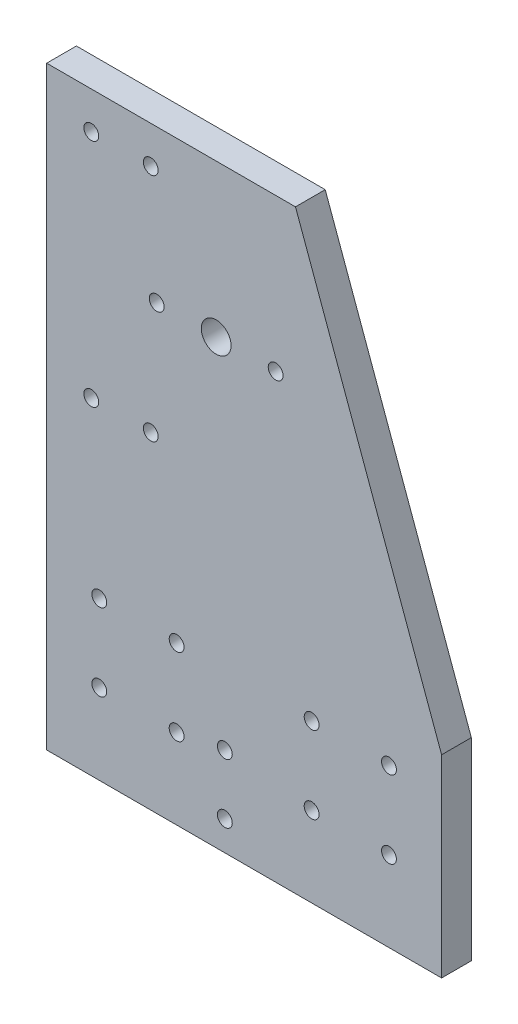
ISO-10303-21;
HEADER;
FILE_DESCRIPTION(('STEP AP214'),'2;1');
FILE_NAME('part.step','',(''),(''),'','','');
FILE_SCHEMA(('AUTOMOTIVE_DESIGN { 1 0 10303 214 1 1 1 1 }'));
ENDSEC;
DATA;
#1=APPLICATION_CONTEXT('core data for automotive mechanical design processes');
#2=APPLICATION_PROTOCOL_DEFINITION('international standard','automotive_design',2000,#1);
#3=PRODUCT_CONTEXT('',#1,'mechanical');
#4=PRODUCT('Part','Part','',(#3));
#5=PRODUCT_RELATED_PRODUCT_CATEGORY('part','',(#4));
#6=PRODUCT_DEFINITION_FORMATION('','',#4);
#7=PRODUCT_DEFINITION_CONTEXT('part definition',#1,'design');
#8=PRODUCT_DEFINITION('design','',#6,#7);
#9=PRODUCT_DEFINITION_SHAPE('','',#8);
#10=(LENGTH_UNIT() NAMED_UNIT(*) SI_UNIT(.MILLI.,.METRE.));
#11=(NAMED_UNIT(*) PLANE_ANGLE_UNIT() SI_UNIT($,.RADIAN.));
#12=(NAMED_UNIT(*) SI_UNIT($,.STERADIAN.) SOLID_ANGLE_UNIT());
#13=UNCERTAINTY_MEASURE_WITH_UNIT(LENGTH_MEASURE(1.E-05),#10,'distance_accuracy_value','');
#14=(GEOMETRIC_REPRESENTATION_CONTEXT(3) GLOBAL_UNCERTAINTY_ASSIGNED_CONTEXT((#13)) GLOBAL_UNIT_ASSIGNED_CONTEXT((#10,
#11,#12)) REPRESENTATION_CONTEXT('',''));
#15=CARTESIAN_POINT('',(0.,0.,0.));
#16=DIRECTION('',(0.,0.,1.));
#17=DIRECTION('',(1.,0.,0.));
#18=AXIS2_PLACEMENT_3D('',#15,#16,#17);
#19=CARTESIAN_POINT('',(0.,0.,0.));
#20=DIRECTION('',(0.,0.,1.));
#21=DIRECTION('',(1.,0.,0.));
#22=AXIS2_PLACEMENT_3D('',#19,#20,#21);
#23=PLANE('',#22);
#24=CARTESIAN_POINT('',(57.,148.75,0.));
#25=DIRECTION('',(0.,0.,-1.));
#26=DIRECTION('',(-1.,0.,0.));
#27=AXIS2_PLACEMENT_3D('',#24,#25,#26);
#28=CIRCLE('',#27,5.);
#29=CARTESIAN_POINT('',(52.,148.75,0.));
#30=VERTEX_POINT('',#29);
#31=EDGE_CURVE('E515',#30,#30,#28,.T.);
#32=ORIENTED_EDGE('',*,*,#31,.F.);
#33=EDGE_LOOP('',(#32));
#34=FACE_BOUND('',#33,.T.);
#35=CARTESIAN_POINT('',(14.9999999999992,110.,0.));
#36=DIRECTION('',(0.,0.,-1.));
#37=DIRECTION('',(-1.,0.,0.));
#38=AXIS2_PLACEMENT_3D('',#35,#36,#37);
#39=CIRCLE('',#38,2.5);
#40=CARTESIAN_POINT('',(12.4999999999992,110.,0.));
#41=VERTEX_POINT('',#40);
#42=EDGE_CURVE('E519',#41,#41,#39,.T.);
#43=ORIENTED_EDGE('',*,*,#42,.F.);
#44=EDGE_LOOP('',(#43));
#45=FACE_BOUND('',#44,.T.);
#46=CARTESIAN_POINT('',(34.9999999999992,110.,0.));
#47=DIRECTION('',(0.,0.,-1.));
#48=DIRECTION('',(-1.,0.,0.));
#49=AXIS2_PLACEMENT_3D('',#46,#47,#48);
#50=CIRCLE('',#49,2.5);
#51=CARTESIAN_POINT('',(32.4999999999992,110.,0.));
#52=VERTEX_POINT('',#51);
#53=EDGE_CURVE('E507',#52,#52,#50,.T.);
#54=ORIENTED_EDGE('',*,*,#53,.F.);
#55=EDGE_LOOP('',(#54));
#56=FACE_BOUND('',#55,.T.);
#57=CARTESIAN_POINT('',(15.,187.5,0.));
#58=DIRECTION('',(0.,0.,-1.));
#59=DIRECTION('',(-1.,0.,0.));
#60=AXIS2_PLACEMENT_3D('',#57,#58,#59);
#61=CIRCLE('',#60,2.5);
#62=CARTESIAN_POINT('',(12.5,187.5,0.));
#63=VERTEX_POINT('',#62);
#64=EDGE_CURVE('E511',#63,#63,#61,.T.);
#65=ORIENTED_EDGE('',*,*,#64,.F.);
#66=EDGE_LOOP('',(#65));
#67=FACE_BOUND('',#66,.T.);
#68=CARTESIAN_POINT('',(77.,148.75,0.));
#69=DIRECTION('',(0.,0.,-1.));
#70=DIRECTION('',(-1.,0.,0.));
#71=AXIS2_PLACEMENT_3D('',#68,#69,#70);
#72=CIRCLE('',#71,2.50000000000001);
#73=CARTESIAN_POINT('',(74.5,148.75,0.));
#74=VERTEX_POINT('',#73);
#75=EDGE_CURVE('E527',#74,#74,#72,.T.);
#76=ORIENTED_EDGE('',*,*,#75,.F.);
#77=EDGE_LOOP('',(#76));
#78=FACE_BOUND('',#77,.T.);
#79=CARTESIAN_POINT('',(37.,148.75,0.));
#80=DIRECTION('',(0.,0.,-1.));
#81=DIRECTION('',(-1.,0.,0.));
#82=AXIS2_PLACEMENT_3D('',#79,#80,#81);
#83=CIRCLE('',#82,2.5);
#84=CARTESIAN_POINT('',(34.5,148.75,0.));
#85=VERTEX_POINT('',#84);
#86=EDGE_CURVE('E523',#85,#85,#83,.T.);
#87=ORIENTED_EDGE('',*,*,#86,.F.);
#88=EDGE_LOOP('',(#87));
#89=FACE_BOUND('',#88,.T.);
#90=CARTESIAN_POINT('',(35.,187.5,0.));
#91=DIRECTION('',(0.,0.,-1.));
#92=DIRECTION('',(-1.,0.,0.));
#93=AXIS2_PLACEMENT_3D('',#90,#91,#92);
#94=CIRCLE('',#93,2.5);
#95=CARTESIAN_POINT('',(32.5,187.5,0.));
#96=VERTEX_POINT('',#95);
#97=EDGE_CURVE('E503',#96,#96,#94,.T.);
#98=ORIENTED_EDGE('',*,*,#97,.F.);
#99=EDGE_LOOP('',(#98));
#100=FACE_BOUND('',#99,.T.);
#101=CARTESIAN_POINT('',(43.7,27.,0.));
#102=DIRECTION('',(0.,0.,1.));
#103=DIRECTION('',(1.,0.,0.));
#104=AXIS2_PLACEMENT_3D('',#101,#102,#103);
#105=CIRCLE('',#104,2.50000000000001);
#106=CARTESIAN_POINT('',(46.2,27.,0.));
#107=VERTEX_POINT('',#106);
#108=EDGE_CURVE('E239',#107,#107,#105,.F.);
#109=ORIENTED_EDGE('',*,*,#108,.F.);
#110=EDGE_LOOP('',(#109));
#111=FACE_BOUND('',#110,.T.);
#112=CARTESIAN_POINT('',(89.1,53.,0.));
#113=DIRECTION('',(0.,0.,1.));
#114=DIRECTION('',(1.,0.,0.));
#115=AXIS2_PLACEMENT_3D('',#112,#113,#114);
#116=CIRCLE('',#115,2.50000000000001);
#117=CARTESIAN_POINT('',(91.6,53.,0.));
#118=VERTEX_POINT('',#117);
#119=EDGE_CURVE('E308',#118,#118,#116,.F.);
#120=ORIENTED_EDGE('',*,*,#119,.F.);
#121=EDGE_LOOP('',(#120));
#122=FACE_BOUND('',#121,.T.);
#123=DIRECTION('',(0.,1.,0.));
#124=VECTOR('',#123,1.);
#125=CARTESIAN_POINT('',(132.8,0.,0.));
#126=LINE('',#125,#124);
#127=CARTESIAN_POINT('',(132.8,0.,0.));
#128=VERTEX_POINT('',#127);
#129=CARTESIAN_POINT('',(132.8,65.,0.));
#130=VERTEX_POINT('',#129);
#131=EDGE_CURVE('E294',#128,#130,#126,.T.);
#132=ORIENTED_EDGE('',*,*,#131,.F.);
#133=DIRECTION('',(1.,0.,0.));
#134=VECTOR('',#133,1.);
#135=CARTESIAN_POINT('',(0.,0.,0.));
#136=LINE('',#135,#134);
#137=CARTESIAN_POINT('',(0.,0.,0.));
#138=VERTEX_POINT('',#137);
#139=EDGE_CURVE('E306',#138,#128,#136,.T.);
#140=ORIENTED_EDGE('',*,*,#139,.F.);
#141=DIRECTION('',(0.,1.,0.));
#142=VECTOR('',#141,1.);
#143=CARTESIAN_POINT('',(0.,0.,0.));
#144=LINE('',#143,#142);
#145=CARTESIAN_POINT('',(0.,200.,0.));
#146=VERTEX_POINT('',#145);
#147=EDGE_CURVE('E303',#138,#146,#144,.T.);
#148=ORIENTED_EDGE('',*,*,#147,.T.);
#149=DIRECTION('',(1.,0.,0.));
#150=VECTOR('',#149,1.);
#151=CARTESIAN_POINT('',(0.,200.,0.));
#152=LINE('',#151,#150);
#153=CARTESIAN_POINT('',(83.6640183740626,200.,0.));
#154=VERTEX_POINT('',#153);
#155=EDGE_CURVE('E300',#146,#154,#152,.T.);
#156=ORIENTED_EDGE('',*,*,#155,.T.);
#157=DIRECTION('',(-0.342020143325669,0.939692620785908,0.));
#158=VECTOR('',#157,1.);
#159=CARTESIAN_POINT('',(138.155948337913,50.2846528818195,0.));
#160=LINE('',#159,#158);
#161=EDGE_CURVE('E297',#130,#154,#160,.T.);
#162=ORIENTED_EDGE('',*,*,#161,.F.);
#163=EDGE_LOOP('',(#132,#140,#148,#156,#162));
#164=FACE_BOUND('',#163,.T.);
#165=CARTESIAN_POINT('',(115.1,27.,0.));
#166=DIRECTION('',(0.,0.,1.));
#167=DIRECTION('',(1.,0.,0.));
#168=AXIS2_PLACEMENT_3D('',#165,#166,#167);
#169=CIRCLE('',#168,2.50000000000001);
#170=CARTESIAN_POINT('',(117.6,27.,0.));
#171=VERTEX_POINT('',#170);
#172=EDGE_CURVE('E291',#171,#171,#169,.T.);
#173=ORIENTED_EDGE('',*,*,#172,.T.);
#174=EDGE_LOOP('',(#173));
#175=FACE_BOUND('',#174,.T.);
#176=CARTESIAN_POINT('',(89.1,27.,0.));
#177=DIRECTION('',(0.,0.,1.));
#178=DIRECTION('',(1.,0.,0.));
#179=AXIS2_PLACEMENT_3D('',#176,#177,#178);
#180=CIRCLE('',#179,2.50000000000001);
#181=CARTESIAN_POINT('',(91.6,27.,0.));
#182=VERTEX_POINT('',#181);
#183=EDGE_CURVE('E288',#182,#182,#180,.T.);
#184=ORIENTED_EDGE('',*,*,#183,.T.);
#185=EDGE_LOOP('',(#184));
#186=FACE_BOUND('',#185,.T.);
#187=CARTESIAN_POINT('',(115.1,53.,0.));
#188=DIRECTION('',(0.,0.,1.));
#189=DIRECTION('',(1.,0.,0.));
#190=AXIS2_PLACEMENT_3D('',#187,#188,#189);
#191=CIRCLE('',#190,2.50000000000001);
#192=CARTESIAN_POINT('',(117.6,53.,0.));
#193=VERTEX_POINT('',#192);
#194=EDGE_CURVE('E285',#193,#193,#191,.F.);
#195=ORIENTED_EDGE('',*,*,#194,.F.);
#196=EDGE_LOOP('',(#195));
#197=FACE_BOUND('',#196,.T.);
#198=CARTESIAN_POINT('',(17.7,53.,0.));
#199=DIRECTION('',(0.,0.,1.));
#200=DIRECTION('',(1.,0.,0.));
#201=AXIS2_PLACEMENT_3D('',#198,#199,#200);
#202=CIRCLE('',#201,2.50000000000001);
#203=CARTESIAN_POINT('',(20.2,53.,0.));
#204=VERTEX_POINT('',#203);
#205=EDGE_CURVE('E282',#204,#204,#202,.T.);
#206=ORIENTED_EDGE('',*,*,#205,.T.);
#207=EDGE_LOOP('',(#206));
#208=FACE_BOUND('',#207,.T.);
#209=CARTESIAN_POINT('',(17.7,27.,0.));
#210=DIRECTION('',(0.,0.,1.));
#211=DIRECTION('',(1.,0.,0.));
#212=AXIS2_PLACEMENT_3D('',#209,#210,#211);
#213=CIRCLE('',#212,2.50000000000001);
#214=CARTESIAN_POINT('',(20.2,27.,0.));
#215=VERTEX_POINT('',#214);
#216=EDGE_CURVE('E179',#215,#215,#213,.F.);
#217=ORIENTED_EDGE('',*,*,#216,.F.);
#218=EDGE_LOOP('',(#217));
#219=FACE_BOUND('',#218,.T.);
#220=CARTESIAN_POINT('',(43.7,53.,0.));
#221=DIRECTION('',(0.,0.,1.));
#222=DIRECTION('',(1.,0.,0.));
#223=AXIS2_PLACEMENT_3D('',#220,#221,#222);
#224=CIRCLE('',#223,2.50000000000001);
#225=CARTESIAN_POINT('',(46.2,53.,0.));
#226=VERTEX_POINT('',#225);
#227=EDGE_CURVE('E175',#226,#226,#224,.T.);
#228=ORIENTED_EDGE('',*,*,#227,.T.);
#229=EDGE_LOOP('',(#228));
#230=FACE_BOUND('',#229,.T.);
#231=DIRECTION('',(-1.,0.,0.));
#232=VECTOR('',#231,1.);
#233=CARTESIAN_POINT('',(0.,5.91463250749698,0.));
#234=LINE('',#233,#232);
#235=CARTESIAN_POINT('',(62.2225,5.91463250749698,0.));
#236=VERTEX_POINT('',#235);
#237=CARTESIAN_POINT('',(57.5975,5.91463250749698,0.));
#238=VERTEX_POINT('',#237);
#239=EDGE_CURVE('E189',#236,#238,#234,.T.);
#240=ORIENTED_EDGE('',*,*,#239,.F.);
#241=DIRECTION('',(-0.5,-0.866025403784438,0.));
#242=VECTOR('',#241,1.);
#243=CARTESIAN_POINT('',(44.1057639972292,-25.4644747166144,0.));
#244=LINE('',#243,#242);
#245=CARTESIAN_POINT('',(64.535,9.92,0.));
#246=VERTEX_POINT('',#245);
#247=EDGE_CURVE('E58',#246,#236,#244,.T.);
#248=ORIENTED_EDGE('',*,*,#247,.F.);
#249=DIRECTION('',(0.500000000000001,-0.866025403784438,0.));
#250=VECTOR('',#249,1.);
#251=CARTESIAN_POINT('',(52.6967360027708,30.4244747166144,0.));
#252=LINE('',#251,#250);
#253=CARTESIAN_POINT('',(62.2225,13.925367492503,0.));
#254=VERTEX_POINT('',#253);
#255=EDGE_CURVE('E209',#254,#246,#252,.T.);
#256=ORIENTED_EDGE('',*,*,#255,.F.);
#257=DIRECTION('',(1.,0.,0.));
#258=VECTOR('',#257,1.);
#259=CARTESIAN_POINT('',(0.,13.925367492503,0.));
#260=LINE('',#259,#258);
#261=CARTESIAN_POINT('',(57.5975,13.925367492503,0.));
#262=VERTEX_POINT('',#261);
#263=EDGE_CURVE('E213',#262,#254,#260,.T.);
#264=ORIENTED_EDGE('',*,*,#263,.F.);
#265=DIRECTION('',(0.499999999999999,0.866025403784439,0.));
#266=VECTOR('',#265,1.);
#267=CARTESIAN_POINT('',(37.1682639972292,-21.4591072241113,0.));
#268=LINE('',#267,#266);
#269=CARTESIAN_POINT('',(55.285,9.92,0.));
#270=VERTEX_POINT('',#269);
#271=EDGE_CURVE('E216',#270,#262,#268,.T.);
#272=ORIENTED_EDGE('',*,*,#271,.F.);
#273=DIRECTION('',(-0.5,0.866025403784439,0.));
#274=VECTOR('',#273,1.);
#275=CARTESIAN_POINT('',(45.7592360027708,26.4191072241113,0.));
#276=LINE('',#275,#274);
#277=EDGE_CURVE('E219',#238,#270,#276,.T.);
#278=ORIENTED_EDGE('',*,*,#277,.F.);
#279=EDGE_LOOP('',(#240,#248,#256,#264,#272,#278));
#280=FACE_BOUND('',#279,.T.);
#281=DIRECTION('',(1.,0.,0.));
#282=VECTOR('',#281,1.);
#283=CARTESIAN_POINT('',(0.,25.914632507497,0.));
#284=LINE('',#283,#282);
#285=CARTESIAN_POINT('',(57.5975,25.914632507497,0.));
#286=VERTEX_POINT('',#285);
#287=CARTESIAN_POINT('',(62.2225,25.914632507497,0.));
#288=VERTEX_POINT('',#287);
#289=EDGE_CURVE('E50',#286,#288,#284,.T.);
#290=ORIENTED_EDGE('',*,*,#289,.T.);
#291=DIRECTION('',(0.500000000000001,0.866025403784438,0.));
#292=VECTOR('',#291,1.);
#293=CARTESIAN_POINT('',(35.4455099593847,-20.4644747166144,0.));
#294=LINE('',#293,#292);
#295=CARTESIAN_POINT('',(64.535,29.92,0.));
#296=VERTEX_POINT('',#295);
#297=EDGE_CURVE('E174',#288,#296,#294,.T.);
#298=ORIENTED_EDGE('',*,*,#297,.T.);
#299=DIRECTION('',(-0.5,0.866025403784438,0.));
#300=VECTOR('',#299,1.);
#301=CARTESIAN_POINT('',(61.3569900406152,35.4244747166144,0.));
#302=LINE('',#301,#300);
#303=CARTESIAN_POINT('',(62.2225,33.925367492503,0.));
#304=VERTEX_POINT('',#303);
#305=EDGE_CURVE('E464',#296,#304,#302,.T.);
#306=ORIENTED_EDGE('',*,*,#305,.T.);
#307=DIRECTION('',(-1.,0.,0.));
#308=VECTOR('',#307,1.);
#309=CARTESIAN_POINT('',(0.,33.925367492503,0.));
#310=LINE('',#309,#308);
#311=CARTESIAN_POINT('',(57.5975,33.925367492503,0.));
#312=VERTEX_POINT('',#311);
#313=EDGE_CURVE('E471',#304,#312,#310,.T.);
#314=ORIENTED_EDGE('',*,*,#313,.T.);
#315=DIRECTION('',(-0.5,-0.866025403784439,0.));
#316=VECTOR('',#315,1.);
#317=CARTESIAN_POINT('',(28.5080099593848,-16.4591072241113,0.));
#318=LINE('',#317,#316);
#319=CARTESIAN_POINT('',(55.285,29.92,0.));
#320=VERTEX_POINT('',#319);
#321=EDGE_CURVE('E474',#312,#320,#318,.T.);
#322=ORIENTED_EDGE('',*,*,#321,.T.);
#323=DIRECTION('',(0.499999999999999,-0.866025403784439,0.));
#324=VECTOR('',#323,1.);
#325=CARTESIAN_POINT('',(54.4194900406152,31.4191072241113,0.));
#326=LINE('',#325,#324);
#327=EDGE_CURVE('E462',#320,#286,#326,.T.);
#328=ORIENTED_EDGE('',*,*,#327,.T.);
#329=EDGE_LOOP('',(#290,#298,#306,#314,#322,#328));
#330=FACE_BOUND('',#329,.T.);
#331=ADVANCED_FACE('F35',(#34,#45,#56,#67,#78,#89,#100,#111,#122,#164,#175,#186,#197,#208,#219,
#230,#280,#330),#23,.F.);
#332=CARTESIAN_POINT('',(132.8,0.,10.));
#333=DIRECTION('',(-1.,0.,0.));
#334=DIRECTION('',(0.,0.,1.));
#335=AXIS2_PLACEMENT_3D('',#332,#333,#334);
#336=PLANE('',#335);
#337=ORIENTED_EDGE('',*,*,#131,.T.);
#338=DIRECTION('',(0.,0.,-1.));
#339=VECTOR('',#338,1.);
#340=CARTESIAN_POINT('',(132.8,65.,10.));
#341=LINE('',#340,#339);
#342=CARTESIAN_POINT('',(132.8,65.,10.));
#343=VERTEX_POINT('',#342);
#344=EDGE_CURVE('E11',#343,#130,#341,.T.);
#345=ORIENTED_EDGE('',*,*,#344,.F.);
#346=DIRECTION('',(0.,1.,0.));
#347=VECTOR('',#346,1.);
#348=CARTESIAN_POINT('',(132.8,0.,10.));
#349=LINE('',#348,#347);
#350=CARTESIAN_POINT('',(132.8,0.,10.));
#351=VERTEX_POINT('',#350);
#352=EDGE_CURVE('E254',#351,#343,#349,.T.);
#353=ORIENTED_EDGE('',*,*,#352,.F.);
#354=DIRECTION('',(0.,0.,-1.));
#355=VECTOR('',#354,1.);
#356=CARTESIAN_POINT('',(132.8,0.,10.));
#357=LINE('',#356,#355);
#358=EDGE_CURVE('E278',#351,#128,#357,.T.);
#359=ORIENTED_EDGE('',*,*,#358,.T.);
#360=EDGE_LOOP('',(#337,#345,#353,#359));
#361=FACE_BOUND('',#360,.T.);
#362=ADVANCED_FACE('F341',(#361),#336,.F.);
#363=CARTESIAN_POINT('',(138.155948337913,50.2846528818195,10.));
#364=DIRECTION('',(-0.939692620785908,-0.342020143325669,0.));
#365=DIRECTION('',(0.342020143325669,-0.939692620785908,0.));
#366=AXIS2_PLACEMENT_3D('',#363,#364,#365);
#367=PLANE('',#366);
#368=ORIENTED_EDGE('',*,*,#161,.T.);
#369=DIRECTION('',(0.,0.,-1.));
#370=VECTOR('',#369,1.);
#371=CARTESIAN_POINT('',(83.6640183740626,200.,10.));
#372=LINE('',#371,#370);
#373=CARTESIAN_POINT('',(83.6640183740626,200.,10.));
#374=VERTEX_POINT('',#373);
#375=EDGE_CURVE('E43',#374,#154,#372,.T.);
#376=ORIENTED_EDGE('',*,*,#375,.F.);
#377=DIRECTION('',(-0.342020143325669,0.939692620785908,0.));
#378=VECTOR('',#377,1.);
#379=CARTESIAN_POINT('',(138.155948337913,50.2846528818195,10.));
#380=LINE('',#379,#378);
#381=EDGE_CURVE('E257',#343,#374,#380,.T.);
#382=ORIENTED_EDGE('',*,*,#381,.F.);
#383=ORIENTED_EDGE('',*,*,#344,.T.);
#384=EDGE_LOOP('',(#368,#376,#382,#383));
#385=FACE_BOUND('',#384,.T.);
#386=ADVANCED_FACE('F324',(#385),#367,.F.);
#387=CARTESIAN_POINT('',(0.,200.,10.));
#388=DIRECTION('',(0.,1.,0.));
#389=DIRECTION('',(0.,0.,1.));
#390=AXIS2_PLACEMENT_3D('',#387,#388,#389);
#391=PLANE('',#390);
#392=ORIENTED_EDGE('',*,*,#155,.F.);
#393=DIRECTION('',(0.,0.,-1.));
#394=VECTOR('',#393,1.);
#395=CARTESIAN_POINT('',(0.,200.,10.));
#396=LINE('',#395,#394);
#397=CARTESIAN_POINT('',(0.,200.,10.));
#398=VERTEX_POINT('',#397);
#399=EDGE_CURVE('E317',#398,#146,#396,.T.);
#400=ORIENTED_EDGE('',*,*,#399,.F.);
#401=DIRECTION('',(1.,0.,0.));
#402=VECTOR('',#401,1.);
#403=CARTESIAN_POINT('',(0.,200.,10.));
#404=LINE('',#403,#402);
#405=EDGE_CURVE('E259',#398,#374,#404,.T.);
#406=ORIENTED_EDGE('',*,*,#405,.T.);
#407=ORIENTED_EDGE('',*,*,#375,.T.);
#408=EDGE_LOOP('',(#392,#400,#406,#407));
#409=FACE_BOUND('',#408,.T.);
#410=ADVANCED_FACE('F321',(#409),#391,.T.);
#411=CARTESIAN_POINT('',(0.,0.,10.));
#412=DIRECTION('',(-1.,0.,0.));
#413=DIRECTION('',(0.,0.,1.));
#414=AXIS2_PLACEMENT_3D('',#411,#412,#413);
#415=PLANE('',#414);
#416=ORIENTED_EDGE('',*,*,#147,.F.);
#417=DIRECTION('',(0.,0.,-1.));
#418=VECTOR('',#417,1.);
#419=CARTESIAN_POINT('',(0.,0.,10.));
#420=LINE('',#419,#418);
#421=CARTESIAN_POINT('',(0.,0.,10.));
#422=VERTEX_POINT('',#421);
#423=EDGE_CURVE('E315',#422,#138,#420,.T.);
#424=ORIENTED_EDGE('',*,*,#423,.F.);
#425=DIRECTION('',(0.,1.,0.));
#426=VECTOR('',#425,1.);
#427=CARTESIAN_POINT('',(0.,0.,10.));
#428=LINE('',#427,#426);
#429=EDGE_CURVE('E262',#422,#398,#428,.T.);
#430=ORIENTED_EDGE('',*,*,#429,.T.);
#431=ORIENTED_EDGE('',*,*,#399,.T.);
#432=EDGE_LOOP('',(#416,#424,#430,#431));
#433=FACE_BOUND('',#432,.T.);
#434=ADVANCED_FACE('F332',(#433),#415,.T.);
#435=CARTESIAN_POINT('',(59.91,29.92,10.));
#436=DIRECTION('',(0.,0.,-1.));
#437=DIRECTION('',(-1.,0.,0.));
#438=AXIS2_PLACEMENT_3D('',#435,#436,#437);
#439=CYLINDRICAL_SURFACE('',#438,2.5);
#440=CARTESIAN_POINT('',(59.91,29.92,5.));
#441=DIRECTION('',(0.,0.,1.));
#442=DIRECTION('',(1.,0.,0.));
#443=AXIS2_PLACEMENT_3D('',#440,#441,#442);
#444=CIRCLE('',#443,2.5);
#445=CARTESIAN_POINT('',(62.41,29.92,5.));
#446=VERTEX_POINT('',#445);
#447=EDGE_CURVE('E170',#446,#446,#444,.T.);
#448=ORIENTED_EDGE('',*,*,#447,.F.);
#449=EDGE_LOOP('',(#448));
#450=FACE_BOUND('',#449,.T.);
#451=CARTESIAN_POINT('',(59.91,29.92,10.));
#452=DIRECTION('',(0.,0.,1.));
#453=DIRECTION('',(1.,0.,0.));
#454=AXIS2_PLACEMENT_3D('',#451,#452,#453);
#455=CIRCLE('',#454,2.5);
#456=CARTESIAN_POINT('',(62.41,29.92,10.));
#457=VERTEX_POINT('',#456);
#458=EDGE_CURVE('E273',#457,#457,#455,.T.);
#459=ORIENTED_EDGE('',*,*,#458,.T.);
#460=EDGE_LOOP('',(#459));
#461=FACE_BOUND('',#460,.T.);
#462=ADVANCED_FACE('F375',(#450,#461),#439,.F.);
#463=CARTESIAN_POINT('',(43.7,27.,10.));
#464=DIRECTION('',(0.,0.,-1.));
#465=DIRECTION('',(-1.,0.,0.));
#466=AXIS2_PLACEMENT_3D('',#463,#464,#465);
#467=CYLINDRICAL_SURFACE('',#466,2.50000000000001);
#468=CARTESIAN_POINT('',(43.7,27.,10.));
#469=DIRECTION('',(0.,0.,1.));
#470=DIRECTION('',(1.,0.,0.));
#471=AXIS2_PLACEMENT_3D('',#468,#469,#470);
#472=CIRCLE('',#471,2.50000000000001);
#473=CARTESIAN_POINT('',(46.2,27.,10.));
#474=VERTEX_POINT('',#473);
#475=EDGE_CURVE('E270',#474,#474,#472,.F.);
#476=ORIENTED_EDGE('',*,*,#475,.F.);
#477=EDGE_LOOP('',(#476));
#478=FACE_BOUND('',#477,.T.);
#479=ORIENTED_EDGE('',*,*,#108,.T.);
#480=EDGE_LOOP('',(#479));
#481=FACE_BOUND('',#480,.T.);
#482=ADVANCED_FACE('F355',(#478,#481),#467,.F.);
#483=CARTESIAN_POINT('',(89.1,53.,10.));
#484=DIRECTION('',(0.,0.,-1.));
#485=DIRECTION('',(-1.,0.,0.));
#486=AXIS2_PLACEMENT_3D('',#483,#484,#485);
#487=CYLINDRICAL_SURFACE('',#486,2.50000000000001);
#488=CARTESIAN_POINT('',(89.1,53.,10.));
#489=DIRECTION('',(0.,0.,1.));
#490=DIRECTION('',(1.,0.,0.));
#491=AXIS2_PLACEMENT_3D('',#488,#489,#490);
#492=CIRCLE('',#491,2.50000000000001);
#493=CARTESIAN_POINT('',(91.6,53.,10.));
#494=VERTEX_POINT('',#493);
#495=EDGE_CURVE('E267',#494,#494,#492,.F.);
#496=ORIENTED_EDGE('',*,*,#495,.F.);
#497=EDGE_LOOP('',(#496));
#498=FACE_BOUND('',#497,.T.);
#499=ORIENTED_EDGE('',*,*,#119,.T.);
#500=EDGE_LOOP('',(#499));
#501=FACE_BOUND('',#500,.T.);
#502=ADVANCED_FACE('F346',(#498,#501),#487,.F.);
#503=CARTESIAN_POINT('',(0.,0.,10.));
#504=DIRECTION('',(0.,1.,0.));
#505=DIRECTION('',(0.,0.,1.));
#506=AXIS2_PLACEMENT_3D('',#503,#504,#505);
#507=PLANE('',#506);
#508=ORIENTED_EDGE('',*,*,#139,.T.);
#509=ORIENTED_EDGE('',*,*,#358,.F.);
#510=DIRECTION('',(1.,0.,0.));
#511=VECTOR('',#510,1.);
#512=CARTESIAN_POINT('',(0.,0.,10.));
#513=LINE('',#512,#511);
#514=EDGE_CURVE('E265',#422,#351,#513,.T.);
#515=ORIENTED_EDGE('',*,*,#514,.F.);
#516=ORIENTED_EDGE('',*,*,#423,.T.);
#517=EDGE_LOOP('',(#508,#509,#515,#516));
#518=FACE_BOUND('',#517,.T.);
#519=ADVANCED_FACE('F343',(#518),#507,.F.);
#520=CARTESIAN_POINT('',(115.1,27.,10.));
#521=DIRECTION('',(0.,0.,-1.));
#522=DIRECTION('',(-1.,0.,0.));
#523=AXIS2_PLACEMENT_3D('',#520,#521,#522);
#524=CYLINDRICAL_SURFACE('',#523,2.50000000000001);
#525=CARTESIAN_POINT('',(115.1,27.,10.));
#526=DIRECTION('',(0.,0.,1.));
#527=DIRECTION('',(1.,0.,0.));
#528=AXIS2_PLACEMENT_3D('',#525,#526,#527);
#529=CIRCLE('',#528,2.50000000000001);
#530=CARTESIAN_POINT('',(117.6,27.,10.));
#531=VERTEX_POINT('',#530);
#532=EDGE_CURVE('E251',#531,#531,#529,.T.);
#533=ORIENTED_EDGE('',*,*,#532,.T.);
#534=EDGE_LOOP('',(#533));
#535=FACE_BOUND('',#534,.T.);
#536=ORIENTED_EDGE('',*,*,#172,.F.);
#537=EDGE_LOOP('',(#536));
#538=FACE_BOUND('',#537,.T.);
#539=ADVANCED_FACE('F345',(#535,#538),#524,.F.);
#540=CARTESIAN_POINT('',(89.1,27.,10.));
#541=DIRECTION('',(0.,0.,-1.));
#542=DIRECTION('',(-1.,0.,0.));
#543=AXIS2_PLACEMENT_3D('',#540,#541,#542);
#544=CYLINDRICAL_SURFACE('',#543,2.50000000000001);
#545=CARTESIAN_POINT('',(89.1,27.,10.));
#546=DIRECTION('',(0.,0.,1.));
#547=DIRECTION('',(1.,0.,0.));
#548=AXIS2_PLACEMENT_3D('',#545,#546,#547);
#549=CIRCLE('',#548,2.50000000000001);
#550=CARTESIAN_POINT('',(91.6,27.,10.));
#551=VERTEX_POINT('',#550);
#552=EDGE_CURVE('E248',#551,#551,#549,.T.);
#553=ORIENTED_EDGE('',*,*,#552,.T.);
#554=EDGE_LOOP('',(#553));
#555=FACE_BOUND('',#554,.T.);
#556=ORIENTED_EDGE('',*,*,#183,.F.);
#557=EDGE_LOOP('',(#556));
#558=FACE_BOUND('',#557,.T.);
#559=ADVANCED_FACE('F352',(#555,#558),#544,.F.);
#560=CARTESIAN_POINT('',(115.1,53.,10.));
#561=DIRECTION('',(0.,0.,-1.));
#562=DIRECTION('',(-1.,0.,0.));
#563=AXIS2_PLACEMENT_3D('',#560,#561,#562);
#564=CYLINDRICAL_SURFACE('',#563,2.50000000000001);
#565=CARTESIAN_POINT('',(115.1,53.,10.));
#566=DIRECTION('',(0.,0.,1.));
#567=DIRECTION('',(1.,0.,0.));
#568=AXIS2_PLACEMENT_3D('',#565,#566,#567);
#569=CIRCLE('',#568,2.50000000000001);
#570=CARTESIAN_POINT('',(117.6,53.,10.));
#571=VERTEX_POINT('',#570);
#572=EDGE_CURVE('E245',#571,#571,#569,.F.);
#573=ORIENTED_EDGE('',*,*,#572,.F.);
#574=EDGE_LOOP('',(#573));
#575=FACE_BOUND('',#574,.T.);
#576=ORIENTED_EDGE('',*,*,#194,.T.);
#577=EDGE_LOOP('',(#576));
#578=FACE_BOUND('',#577,.T.);
#579=ADVANCED_FACE('F770',(#575,#578),#564,.F.);
#580=CARTESIAN_POINT('',(17.7,53.,10.));
#581=DIRECTION('',(0.,0.,-1.));
#582=DIRECTION('',(-1.,0.,0.));
#583=AXIS2_PLACEMENT_3D('',#580,#581,#582);
#584=CYLINDRICAL_SURFACE('',#583,2.50000000000001);
#585=CARTESIAN_POINT('',(17.7,53.,10.));
#586=DIRECTION('',(0.,0.,1.));
#587=DIRECTION('',(1.,0.,0.));
#588=AXIS2_PLACEMENT_3D('',#585,#586,#587);
#589=CIRCLE('',#588,2.50000000000001);
#590=CARTESIAN_POINT('',(20.2,53.,10.));
#591=VERTEX_POINT('',#590);
#592=EDGE_CURVE('E242',#591,#591,#589,.T.);
#593=ORIENTED_EDGE('',*,*,#592,.T.);
#594=EDGE_LOOP('',(#593));
#595=FACE_BOUND('',#594,.T.);
#596=ORIENTED_EDGE('',*,*,#205,.F.);
#597=EDGE_LOOP('',(#596));
#598=FACE_BOUND('',#597,.T.);
#599=ADVANCED_FACE('F762',(#595,#598),#584,.F.);
#600=CARTESIAN_POINT('',(17.7,27.,10.));
#601=DIRECTION('',(0.,0.,-1.));
#602=DIRECTION('',(-1.,0.,0.));
#603=AXIS2_PLACEMENT_3D('',#600,#601,#602);
#604=CYLINDRICAL_SURFACE('',#603,2.50000000000001);
#605=CARTESIAN_POINT('',(17.7,27.,10.));
#606=DIRECTION('',(0.,0.,1.));
#607=DIRECTION('',(1.,0.,0.));
#608=AXIS2_PLACEMENT_3D('',#605,#606,#607);
#609=CIRCLE('',#608,2.50000000000001);
#610=CARTESIAN_POINT('',(20.2,27.,10.));
#611=VERTEX_POINT('',#610);
#612=EDGE_CURVE('E238',#611,#611,#609,.F.);
#613=ORIENTED_EDGE('',*,*,#612,.F.);
#614=EDGE_LOOP('',(#613));
#615=FACE_BOUND('',#614,.T.);
#616=ORIENTED_EDGE('',*,*,#216,.T.);
#617=EDGE_LOOP('',(#616));
#618=FACE_BOUND('',#617,.T.);
#619=ADVANCED_FACE('F754',(#615,#618),#604,.F.);
#620=CARTESIAN_POINT('',(43.7,53.,10.));
#621=DIRECTION('',(0.,0.,-1.));
#622=DIRECTION('',(-1.,0.,0.));
#623=AXIS2_PLACEMENT_3D('',#620,#621,#622);
#624=CYLINDRICAL_SURFACE('',#623,2.50000000000001);
#625=CARTESIAN_POINT('',(43.7,53.,10.));
#626=DIRECTION('',(0.,0.,1.));
#627=DIRECTION('',(1.,0.,0.));
#628=AXIS2_PLACEMENT_3D('',#625,#626,#627);
#629=CIRCLE('',#628,2.50000000000001);
#630=CARTESIAN_POINT('',(46.2,53.,10.));
#631=VERTEX_POINT('',#630);
#632=EDGE_CURVE('E235',#631,#631,#629,.T.);
#633=ORIENTED_EDGE('',*,*,#632,.T.);
#634=EDGE_LOOP('',(#633));
#635=FACE_BOUND('',#634,.T.);
#636=ORIENTED_EDGE('',*,*,#227,.F.);
#637=EDGE_LOOP('',(#636));
#638=FACE_BOUND('',#637,.T.);
#639=ADVANCED_FACE('F37',(#635,#638),#624,.F.);
#640=CARTESIAN_POINT('',(59.91,9.91999999999999,10.));
#641=DIRECTION('',(0.,0.,-1.));
#642=DIRECTION('',(-1.,0.,0.));
#643=AXIS2_PLACEMENT_3D('',#640,#641,#642);
#644=CYLINDRICAL_SURFACE('',#643,2.5);
#645=CARTESIAN_POINT('',(59.91,9.91999999999999,5.));
#646=DIRECTION('',(0.,0.,1.));
#647=DIRECTION('',(1.,0.,0.));
#648=AXIS2_PLACEMENT_3D('',#645,#646,#647);
#649=CIRCLE('',#648,2.5);
#650=CARTESIAN_POINT('',(62.41,9.91999999999999,5.));
#651=VERTEX_POINT('',#650);
#652=EDGE_CURVE('E185',#651,#651,#649,.T.);
#653=ORIENTED_EDGE('',*,*,#652,.F.);
#654=EDGE_LOOP('',(#653));
#655=FACE_BOUND('',#654,.T.);
#656=CARTESIAN_POINT('',(59.91,9.91999999999999,10.));
#657=DIRECTION('',(0.,0.,1.));
#658=DIRECTION('',(1.,0.,0.));
#659=AXIS2_PLACEMENT_3D('',#656,#657,#658);
#660=CIRCLE('',#659,2.5);
#661=CARTESIAN_POINT('',(62.41,9.91999999999999,10.));
#662=VERTEX_POINT('',#661);
#663=EDGE_CURVE('E276',#662,#662,#660,.T.);
#664=ORIENTED_EDGE('',*,*,#663,.T.);
#665=EDGE_LOOP('',(#664));
#666=FACE_BOUND('',#665,.T.);
#667=ADVANCED_FACE('F371',(#655,#666),#644,.F.);
#668=CARTESIAN_POINT('',(0.,0.,10.));
#669=DIRECTION('',(0.,0.,1.));
#670=DIRECTION('',(1.,0.,0.));
#671=AXIS2_PLACEMENT_3D('',#668,#669,#670);
#672=PLANE('',#671);
#673=CARTESIAN_POINT('',(57.,148.75,10.));
#674=DIRECTION('',(0.,0.,-1.));
#675=DIRECTION('',(-1.,0.,0.));
#676=AXIS2_PLACEMENT_3D('',#673,#674,#675);
#677=CIRCLE('',#676,5.);
#678=CARTESIAN_POINT('',(52.,148.75,10.));
#679=VERTEX_POINT('',#678);
#680=EDGE_CURVE('E407',#679,#679,#677,.T.);
#681=ORIENTED_EDGE('',*,*,#680,.T.);
#682=EDGE_LOOP('',(#681));
#683=FACE_BOUND('',#682,.T.);
#684=CARTESIAN_POINT('',(14.9999999999992,110.,10.));
#685=DIRECTION('',(0.,0.,-1.));
#686=DIRECTION('',(-1.,0.,0.));
#687=AXIS2_PLACEMENT_3D('',#684,#685,#686);
#688=CIRCLE('',#687,2.5);
#689=CARTESIAN_POINT('',(12.4999999999992,110.,10.));
#690=VERTEX_POINT('',#689);
#691=EDGE_CURVE('E411',#690,#690,#688,.T.);
#692=ORIENTED_EDGE('',*,*,#691,.T.);
#693=EDGE_LOOP('',(#692));
#694=FACE_BOUND('',#693,.T.);
#695=CARTESIAN_POINT('',(34.9999999999992,110.,10.));
#696=DIRECTION('',(0.,0.,-1.));
#697=DIRECTION('',(-1.,0.,0.));
#698=AXIS2_PLACEMENT_3D('',#695,#696,#697);
#699=CIRCLE('',#698,2.5);
#700=CARTESIAN_POINT('',(32.4999999999992,110.,10.));
#701=VERTEX_POINT('',#700);
#702=EDGE_CURVE('E415',#701,#701,#699,.T.);
#703=ORIENTED_EDGE('',*,*,#702,.T.);
#704=EDGE_LOOP('',(#703));
#705=FACE_BOUND('',#704,.T.);
#706=CARTESIAN_POINT('',(15.,187.5,10.));
#707=DIRECTION('',(0.,0.,-1.));
#708=DIRECTION('',(-1.,0.,0.));
#709=AXIS2_PLACEMENT_3D('',#706,#707,#708);
#710=CIRCLE('',#709,2.5);
#711=CARTESIAN_POINT('',(12.5,187.5,10.));
#712=VERTEX_POINT('',#711);
#713=EDGE_CURVE('E419',#712,#712,#710,.T.);
#714=ORIENTED_EDGE('',*,*,#713,.T.);
#715=EDGE_LOOP('',(#714));
#716=FACE_BOUND('',#715,.T.);
#717=CARTESIAN_POINT('',(77.,148.75,10.));
#718=DIRECTION('',(0.,0.,-1.));
#719=DIRECTION('',(-1.,0.,0.));
#720=AXIS2_PLACEMENT_3D('',#717,#718,#719);
#721=CIRCLE('',#720,2.50000000000001);
#722=CARTESIAN_POINT('',(74.5,148.75,10.));
#723=VERTEX_POINT('',#722);
#724=EDGE_CURVE('E423',#723,#723,#721,.T.);
#725=ORIENTED_EDGE('',*,*,#724,.T.);
#726=EDGE_LOOP('',(#725));
#727=FACE_BOUND('',#726,.T.);
#728=CARTESIAN_POINT('',(37.,148.75,10.));
#729=DIRECTION('',(0.,0.,-1.));
#730=DIRECTION('',(-1.,0.,0.));
#731=AXIS2_PLACEMENT_3D('',#728,#729,#730);
#732=CIRCLE('',#731,2.5);
#733=CARTESIAN_POINT('',(34.5,148.75,10.));
#734=VERTEX_POINT('',#733);
#735=EDGE_CURVE('E427',#734,#734,#732,.T.);
#736=ORIENTED_EDGE('',*,*,#735,.T.);
#737=EDGE_LOOP('',(#736));
#738=FACE_BOUND('',#737,.T.);
#739=CARTESIAN_POINT('',(35.,187.5,10.));
#740=DIRECTION('',(0.,0.,-1.));
#741=DIRECTION('',(-1.,0.,0.));
#742=AXIS2_PLACEMENT_3D('',#739,#740,#741);
#743=CIRCLE('',#742,2.5);
#744=CARTESIAN_POINT('',(32.5,187.5,10.));
#745=VERTEX_POINT('',#744);
#746=EDGE_CURVE('E210',#745,#745,#743,.T.);
#747=ORIENTED_EDGE('',*,*,#746,.T.);
#748=EDGE_LOOP('',(#747));
#749=FACE_BOUND('',#748,.T.);
#750=ORIENTED_EDGE('',*,*,#632,.F.);
#751=EDGE_LOOP('',(#750));
#752=FACE_BOUND('',#751,.T.);
#753=ORIENTED_EDGE('',*,*,#612,.T.);
#754=EDGE_LOOP('',(#753));
#755=FACE_BOUND('',#754,.T.);
#756=ORIENTED_EDGE('',*,*,#592,.F.);
#757=EDGE_LOOP('',(#756));
#758=FACE_BOUND('',#757,.T.);
#759=ORIENTED_EDGE('',*,*,#572,.T.);
#760=EDGE_LOOP('',(#759));
#761=FACE_BOUND('',#760,.T.);
#762=ORIENTED_EDGE('',*,*,#552,.F.);
#763=EDGE_LOOP('',(#762));
#764=FACE_BOUND('',#763,.T.);
#765=ORIENTED_EDGE('',*,*,#532,.F.);
#766=EDGE_LOOP('',(#765));
#767=FACE_BOUND('',#766,.T.);
#768=ORIENTED_EDGE('',*,*,#352,.T.);
#769=ORIENTED_EDGE('',*,*,#381,.T.);
#770=ORIENTED_EDGE('',*,*,#405,.F.);
#771=ORIENTED_EDGE('',*,*,#429,.F.);
#772=ORIENTED_EDGE('',*,*,#514,.T.);
#773=EDGE_LOOP('',(#768,#769,#770,#771,#772));
#774=FACE_BOUND('',#773,.T.);
#775=ORIENTED_EDGE('',*,*,#495,.T.);
#776=EDGE_LOOP('',(#775));
#777=FACE_BOUND('',#776,.T.);
#778=ORIENTED_EDGE('',*,*,#475,.T.);
#779=EDGE_LOOP('',(#778));
#780=FACE_BOUND('',#779,.T.);
#781=ORIENTED_EDGE('',*,*,#458,.F.);
#782=EDGE_LOOP('',(#781));
#783=FACE_BOUND('',#782,.T.);
#784=ORIENTED_EDGE('',*,*,#663,.F.);
#785=EDGE_LOOP('',(#784));
#786=FACE_BOUND('',#785,.T.);
#787=ADVANCED_FACE('F336',(#683,#694,#705,#716,#727,#738,#749,#752,#755,#758,#761,#764,#767,
#774,#777,#780,#783,#786),#672,.T.);
#788=CARTESIAN_POINT('',(44.1057639972292,-25.4644747166144,5.));
#789=DIRECTION('',(0.866025403784438,-0.5,0.));
#790=DIRECTION('',(0.5,0.866025403784438,0.));
#791=AXIS2_PLACEMENT_3D('',#788,#789,#790);
#792=PLANE('',#791);
#793=ORIENTED_EDGE('',*,*,#247,.T.);
#794=DIRECTION('',(0.,0.,-1.));
#795=VECTOR('',#794,1.);
#796=CARTESIAN_POINT('',(62.2225,5.91463250749698,5.));
#797=LINE('',#796,#795);
#798=CARTESIAN_POINT('',(62.2225,5.91463250749698,5.));
#799=VERTEX_POINT('',#798);
#800=EDGE_CURVE('E207',#799,#236,#797,.T.);
#801=ORIENTED_EDGE('',*,*,#800,.F.);
#802=DIRECTION('',(-0.5,-0.866025403784438,0.));
#803=VECTOR('',#802,1.);
#804=CARTESIAN_POINT('',(44.1057639972292,-25.4644747166144,5.));
#805=LINE('',#804,#803);
#806=CARTESIAN_POINT('',(64.535,9.92,5.));
#807=VERTEX_POINT('',#806);
#808=EDGE_CURVE('E188',#807,#799,#805,.T.);
#809=ORIENTED_EDGE('',*,*,#808,.F.);
#810=DIRECTION('',(0.,0.,-1.));
#811=VECTOR('',#810,1.);
#812=CARTESIAN_POINT('',(64.535,9.92,5.));
#813=LINE('',#812,#811);
#814=EDGE_CURVE('E233',#807,#246,#813,.T.);
#815=ORIENTED_EDGE('',*,*,#814,.T.);
#816=EDGE_LOOP('',(#793,#801,#809,#815));
#817=FACE_BOUND('',#816,.T.);
#818=ADVANCED_FACE('F393',(#817),#792,.F.);
#819=CARTESIAN_POINT('',(52.6967360027708,30.4244747166144,5.));
#820=DIRECTION('',(0.866025403784438,0.500000000000001,0.));
#821=DIRECTION('',(-0.500000000000001,0.866025403784438,0.));
#822=AXIS2_PLACEMENT_3D('',#819,#820,#821);
#823=PLANE('',#822);
#824=ORIENTED_EDGE('',*,*,#255,.T.);
#825=ORIENTED_EDGE('',*,*,#814,.F.);
#826=DIRECTION('',(0.500000000000001,-0.866025403784438,0.));
#827=VECTOR('',#826,1.);
#828=CARTESIAN_POINT('',(52.6967360027708,30.4244747166144,5.));
#829=LINE('',#828,#827);
#830=CARTESIAN_POINT('',(62.2225,13.925367492503,5.));
#831=VERTEX_POINT('',#830);
#832=EDGE_CURVE('E192',#831,#807,#829,.T.);
#833=ORIENTED_EDGE('',*,*,#832,.F.);
#834=DIRECTION('',(0.,0.,-1.));
#835=VECTOR('',#834,1.);
#836=CARTESIAN_POINT('',(62.2225,13.925367492503,5.));
#837=LINE('',#836,#835);
#838=EDGE_CURVE('E231',#831,#254,#837,.T.);
#839=ORIENTED_EDGE('',*,*,#838,.T.);
#840=EDGE_LOOP('',(#824,#825,#833,#839));
#841=FACE_BOUND('',#840,.T.);
#842=ADVANCED_FACE('F403',(#841),#823,.F.);
#843=CARTESIAN_POINT('',(0.,13.925367492503,5.));
#844=DIRECTION('',(0.,1.,0.));
#845=DIRECTION('',(0.,0.,1.));
#846=AXIS2_PLACEMENT_3D('',#843,#844,#845);
#847=PLANE('',#846);
#848=ORIENTED_EDGE('',*,*,#263,.T.);
#849=ORIENTED_EDGE('',*,*,#838,.F.);
#850=DIRECTION('',(1.,0.,0.));
#851=VECTOR('',#850,1.);
#852=CARTESIAN_POINT('',(0.,13.925367492503,5.));
#853=LINE('',#852,#851);
#854=CARTESIAN_POINT('',(57.5975,13.925367492503,5.));
#855=VERTEX_POINT('',#854);
#856=EDGE_CURVE('E195',#855,#831,#853,.T.);
#857=ORIENTED_EDGE('',*,*,#856,.F.);
#858=DIRECTION('',(0.,0.,-1.));
#859=VECTOR('',#858,1.);
#860=CARTESIAN_POINT('',(57.5975,13.925367492503,5.));
#861=LINE('',#860,#859);
#862=EDGE_CURVE('E229',#855,#262,#861,.T.);
#863=ORIENTED_EDGE('',*,*,#862,.T.);
#864=EDGE_LOOP('',(#848,#849,#857,#863));
#865=FACE_BOUND('',#864,.T.);
#866=ADVANCED_FACE('F583',(#865),#847,.F.);
#867=CARTESIAN_POINT('',(37.1682639972292,-21.4591072241113,5.));
#868=DIRECTION('',(-0.866025403784439,0.499999999999999,0.));
#869=DIRECTION('',(-0.499999999999999,-0.866025403784439,0.));
#870=AXIS2_PLACEMENT_3D('',#867,#868,#869);
#871=PLANE('',#870);
#872=ORIENTED_EDGE('',*,*,#271,.T.);
#873=ORIENTED_EDGE('',*,*,#862,.F.);
#874=DIRECTION('',(0.499999999999999,0.866025403784439,0.));
#875=VECTOR('',#874,1.);
#876=CARTESIAN_POINT('',(37.1682639972292,-21.4591072241113,5.));
#877=LINE('',#876,#875);
#878=CARTESIAN_POINT('',(55.285,9.92,5.));
#879=VERTEX_POINT('',#878);
#880=EDGE_CURVE('E198',#879,#855,#877,.T.);
#881=ORIENTED_EDGE('',*,*,#880,.F.);
#882=DIRECTION('',(0.,0.,-1.));
#883=VECTOR('',#882,1.);
#884=CARTESIAN_POINT('',(55.285,9.92,5.));
#885=LINE('',#884,#883);
#886=EDGE_CURVE('E227',#879,#270,#885,.T.);
#887=ORIENTED_EDGE('',*,*,#886,.T.);
#888=EDGE_LOOP('',(#872,#873,#881,#887));
#889=FACE_BOUND('',#888,.T.);
#890=ADVANCED_FACE('F579',(#889),#871,.F.);
#891=CARTESIAN_POINT('',(45.7592360027708,26.4191072241113,5.));
#892=DIRECTION('',(-0.866025403784439,-0.5,0.));
#893=DIRECTION('',(0.5,-0.866025403784439,0.));
#894=AXIS2_PLACEMENT_3D('',#891,#892,#893);
#895=PLANE('',#894);
#896=ORIENTED_EDGE('',*,*,#277,.T.);
#897=ORIENTED_EDGE('',*,*,#886,.F.);
#898=DIRECTION('',(-0.5,0.866025403784439,0.));
#899=VECTOR('',#898,1.);
#900=CARTESIAN_POINT('',(45.7592360027708,26.4191072241113,5.));
#901=LINE('',#900,#899);
#902=CARTESIAN_POINT('',(57.5975,5.91463250749698,5.));
#903=VERTEX_POINT('',#902);
#904=EDGE_CURVE('E201',#903,#879,#901,.T.);
#905=ORIENTED_EDGE('',*,*,#904,.F.);
#906=DIRECTION('',(0.,0.,-1.));
#907=VECTOR('',#906,1.);
#908=CARTESIAN_POINT('',(57.5975,5.91463250749698,5.));
#909=LINE('',#908,#907);
#910=EDGE_CURVE('E225',#903,#238,#909,.T.);
#911=ORIENTED_EDGE('',*,*,#910,.T.);
#912=EDGE_LOOP('',(#896,#897,#905,#911));
#913=FACE_BOUND('',#912,.T.);
#914=ADVANCED_FACE('F575',(#913),#895,.F.);
#915=CARTESIAN_POINT('',(0.,5.91463250749698,5.));
#916=DIRECTION('',(0.,-1.,0.));
#917=DIRECTION('',(0.,0.,-1.));
#918=AXIS2_PLACEMENT_3D('',#915,#916,#917);
#919=PLANE('',#918);
#920=ORIENTED_EDGE('',*,*,#239,.T.);
#921=ORIENTED_EDGE('',*,*,#910,.F.);
#922=DIRECTION('',(-1.,0.,0.));
#923=VECTOR('',#922,1.);
#924=CARTESIAN_POINT('',(0.,5.91463250749698,5.));
#925=LINE('',#924,#923);
#926=EDGE_CURVE('E204',#799,#903,#925,.T.);
#927=ORIENTED_EDGE('',*,*,#926,.F.);
#928=ORIENTED_EDGE('',*,*,#800,.T.);
#929=EDGE_LOOP('',(#920,#921,#927,#928));
#930=FACE_BOUND('',#929,.T.);
#931=ADVANCED_FACE('F571',(#930),#919,.F.);
#932=CARTESIAN_POINT('',(0.,0.,5.));
#933=DIRECTION('',(0.,0.,1.));
#934=DIRECTION('',(1.,0.,0.));
#935=AXIS2_PLACEMENT_3D('',#932,#933,#934);
#936=PLANE('',#935);
#937=ORIENTED_EDGE('',*,*,#652,.T.);
#938=EDGE_LOOP('',(#937));
#939=FACE_BOUND('',#938,.T.);
#940=ORIENTED_EDGE('',*,*,#808,.T.);
#941=ORIENTED_EDGE('',*,*,#926,.T.);
#942=ORIENTED_EDGE('',*,*,#904,.T.);
#943=ORIENTED_EDGE('',*,*,#880,.T.);
#944=ORIENTED_EDGE('',*,*,#856,.T.);
#945=ORIENTED_EDGE('',*,*,#832,.T.);
#946=EDGE_LOOP('',(#940,#941,#942,#943,#944,#945));
#947=FACE_BOUND('',#946,.T.);
#948=ADVANCED_FACE('F568',(#939,#947),#936,.F.);
#949=CARTESIAN_POINT('',(0.,25.914632507497,5.));
#950=DIRECTION('',(0.,1.,0.));
#951=DIRECTION('',(0.,0.,1.));
#952=AXIS2_PLACEMENT_3D('',#949,#950,#951);
#953=PLANE('',#952);
#954=ORIENTED_EDGE('',*,*,#289,.F.);
#955=DIRECTION('',(0.,0.,-1.));
#956=VECTOR('',#955,1.);
#957=CARTESIAN_POINT('',(57.5975,25.914632507497,5.));
#958=LINE('',#957,#956);
#959=CARTESIAN_POINT('',(57.5975,25.914632507497,5.));
#960=VERTEX_POINT('',#959);
#961=EDGE_CURVE('E169',#960,#286,#958,.T.);
#962=ORIENTED_EDGE('',*,*,#961,.F.);
#963=DIRECTION('',(1.,0.,0.));
#964=VECTOR('',#963,1.);
#965=CARTESIAN_POINT('',(0.,25.914632507497,5.));
#966=LINE('',#965,#964);
#967=CARTESIAN_POINT('',(62.2225,25.914632507497,5.));
#968=VERTEX_POINT('',#967);
#969=EDGE_CURVE('E160',#960,#968,#966,.T.);
#970=ORIENTED_EDGE('',*,*,#969,.T.);
#971=DIRECTION('',(0.,0.,-1.));
#972=VECTOR('',#971,1.);
#973=CARTESIAN_POINT('',(62.2225,25.914632507497,5.));
#974=LINE('',#973,#972);
#975=EDGE_CURVE('E168',#968,#288,#974,.T.);
#976=ORIENTED_EDGE('',*,*,#975,.T.);
#977=EDGE_LOOP('',(#954,#962,#970,#976));
#978=FACE_BOUND('',#977,.T.);
#979=ADVANCED_FACE('F167',(#978),#953,.T.);
#980=CARTESIAN_POINT('',(35.4455099593847,-20.4644747166144,5.));
#981=DIRECTION('',(-0.866025403784438,0.500000000000001,0.));
#982=DIRECTION('',(-0.500000000000001,-0.866025403784438,0.));
#983=AXIS2_PLACEMENT_3D('',#980,#981,#982);
#984=PLANE('',#983);
#985=ORIENTED_EDGE('',*,*,#297,.F.);
#986=ORIENTED_EDGE('',*,*,#975,.F.);
#987=DIRECTION('',(0.500000000000001,0.866025403784438,0.));
#988=VECTOR('',#987,1.);
#989=CARTESIAN_POINT('',(35.4455099593847,-20.4644747166144,5.));
#990=LINE('',#989,#988);
#991=CARTESIAN_POINT('',(64.535,29.92,5.));
#992=VERTEX_POINT('',#991);
#993=EDGE_CURVE('E156',#968,#992,#990,.T.);
#994=ORIENTED_EDGE('',*,*,#993,.T.);
#995=DIRECTION('',(0.,0.,-1.));
#996=VECTOR('',#995,1.);
#997=CARTESIAN_POINT('',(64.535,29.92,5.));
#998=LINE('',#997,#996);
#999=EDGE_CURVE('E176',#992,#296,#998,.T.);
#1000=ORIENTED_EDGE('',*,*,#999,.T.);
#1001=EDGE_LOOP('',(#985,#986,#994,#1000));
#1002=FACE_BOUND('',#1001,.T.);
#1003=ADVANCED_FACE('F172',(#1002),#984,.T.);
#1004=CARTESIAN_POINT('',(61.3569900406152,35.4244747166144,5.));
#1005=DIRECTION('',(-0.866025403784438,-0.5,0.));
#1006=DIRECTION('',(0.5,-0.866025403784438,0.));
#1007=AXIS2_PLACEMENT_3D('',#1004,#1005,#1006);
#1008=PLANE('',#1007);
#1009=ORIENTED_EDGE('',*,*,#305,.F.);
#1010=ORIENTED_EDGE('',*,*,#999,.F.);
#1011=DIRECTION('',(-0.5,0.866025403784438,0.));
#1012=VECTOR('',#1011,1.);
#1013=CARTESIAN_POINT('',(61.3569900406152,35.4244747166144,5.));
#1014=LINE('',#1013,#1012);
#1015=CARTESIAN_POINT('',(62.2225,33.925367492503,5.));
#1016=VERTEX_POINT('',#1015);
#1017=EDGE_CURVE('E162',#992,#1016,#1014,.T.);
#1018=ORIENTED_EDGE('',*,*,#1017,.T.);
#1019=DIRECTION('',(0.,0.,-1.));
#1020=VECTOR('',#1019,1.);
#1021=CARTESIAN_POINT('',(62.2225,33.925367492503,5.));
#1022=LINE('',#1021,#1020);
#1023=EDGE_CURVE('E181',#1016,#304,#1022,.T.);
#1024=ORIENTED_EDGE('',*,*,#1023,.T.);
#1025=EDGE_LOOP('',(#1009,#1010,#1018,#1024));
#1026=FACE_BOUND('',#1025,.T.);
#1027=ADVANCED_FACE('F485',(#1026),#1008,.T.);
#1028=CARTESIAN_POINT('',(0.,33.925367492503,5.));
#1029=DIRECTION('',(0.,-1.,0.));
#1030=DIRECTION('',(0.,0.,-1.));
#1031=AXIS2_PLACEMENT_3D('',#1028,#1029,#1030);
#1032=PLANE('',#1031);
#1033=ORIENTED_EDGE('',*,*,#313,.F.);
#1034=ORIENTED_EDGE('',*,*,#1023,.F.);
#1035=DIRECTION('',(-1.,0.,0.));
#1036=VECTOR('',#1035,1.);
#1037=CARTESIAN_POINT('',(0.,33.925367492503,5.));
#1038=LINE('',#1037,#1036);
#1039=CARTESIAN_POINT('',(57.5975,33.925367492503,5.));
#1040=VERTEX_POINT('',#1039);
#1041=EDGE_CURVE('E497',#1016,#1040,#1038,.T.);
#1042=ORIENTED_EDGE('',*,*,#1041,.T.);
#1043=DIRECTION('',(0.,0.,-1.));
#1044=VECTOR('',#1043,1.);
#1045=CARTESIAN_POINT('',(57.5975,33.925367492503,5.));
#1046=LINE('',#1045,#1044);
#1047=EDGE_CURVE('E480',#1040,#312,#1046,.T.);
#1048=ORIENTED_EDGE('',*,*,#1047,.T.);
#1049=EDGE_LOOP('',(#1033,#1034,#1042,#1048));
#1050=FACE_BOUND('',#1049,.T.);
#1051=ADVANCED_FACE('F487',(#1050),#1032,.T.);
#1052=CARTESIAN_POINT('',(28.5080099593848,-16.4591072241113,5.));
#1053=DIRECTION('',(0.866025403784439,-0.5,0.));
#1054=DIRECTION('',(0.5,0.866025403784439,0.));
#1055=AXIS2_PLACEMENT_3D('',#1052,#1053,#1054);
#1056=PLANE('',#1055);
#1057=ORIENTED_EDGE('',*,*,#321,.F.);
#1058=ORIENTED_EDGE('',*,*,#1047,.F.);
#1059=DIRECTION('',(-0.5,-0.866025403784439,0.));
#1060=VECTOR('',#1059,1.);
#1061=CARTESIAN_POINT('',(28.5080099593848,-16.4591072241113,5.));
#1062=LINE('',#1061,#1060);
#1063=CARTESIAN_POINT('',(55.285,29.92,5.));
#1064=VERTEX_POINT('',#1063);
#1065=EDGE_CURVE('E494',#1040,#1064,#1062,.T.);
#1066=ORIENTED_EDGE('',*,*,#1065,.T.);
#1067=DIRECTION('',(0.,0.,-1.));
#1068=VECTOR('',#1067,1.);
#1069=CARTESIAN_POINT('',(55.285,29.92,5.));
#1070=LINE('',#1069,#1068);
#1071=EDGE_CURVE('E478',#1064,#320,#1070,.T.);
#1072=ORIENTED_EDGE('',*,*,#1071,.T.);
#1073=EDGE_LOOP('',(#1057,#1058,#1066,#1072));
#1074=FACE_BOUND('',#1073,.T.);
#1075=ADVANCED_FACE('F491',(#1074),#1056,.T.);
#1076=CARTESIAN_POINT('',(54.4194900406152,31.4191072241113,5.));
#1077=DIRECTION('',(0.866025403784439,0.499999999999999,0.));
#1078=DIRECTION('',(-0.499999999999999,0.866025403784439,0.));
#1079=AXIS2_PLACEMENT_3D('',#1076,#1077,#1078);
#1080=PLANE('',#1079);
#1081=ORIENTED_EDGE('',*,*,#327,.F.);
#1082=ORIENTED_EDGE('',*,*,#1071,.F.);
#1083=DIRECTION('',(0.499999999999999,-0.866025403784439,0.));
#1084=VECTOR('',#1083,1.);
#1085=CARTESIAN_POINT('',(54.4194900406152,31.4191072241113,5.));
#1086=LINE('',#1085,#1084);
#1087=EDGE_CURVE('E467',#1064,#960,#1086,.T.);
#1088=ORIENTED_EDGE('',*,*,#1087,.T.);
#1089=ORIENTED_EDGE('',*,*,#961,.T.);
#1090=EDGE_LOOP('',(#1081,#1082,#1088,#1089));
#1091=FACE_BOUND('',#1090,.T.);
#1092=ADVANCED_FACE('F496',(#1091),#1080,.T.);
#1093=CARTESIAN_POINT('',(0.,0.,5.));
#1094=DIRECTION('',(0.,0.,1.));
#1095=DIRECTION('',(1.,0.,0.));
#1096=AXIS2_PLACEMENT_3D('',#1093,#1094,#1095);
#1097=PLANE('',#1096);
#1098=ORIENTED_EDGE('',*,*,#447,.T.);
#1099=EDGE_LOOP('',(#1098));
#1100=FACE_BOUND('',#1099,.T.);
#1101=ORIENTED_EDGE('',*,*,#969,.F.);
#1102=ORIENTED_EDGE('',*,*,#1087,.F.);
#1103=ORIENTED_EDGE('',*,*,#1065,.F.);
#1104=ORIENTED_EDGE('',*,*,#1041,.F.);
#1105=ORIENTED_EDGE('',*,*,#1017,.F.);
#1106=ORIENTED_EDGE('',*,*,#993,.F.);
#1107=EDGE_LOOP('',(#1101,#1102,#1103,#1104,#1105,#1106));
#1108=FACE_BOUND('',#1107,.T.);
#1109=ADVANCED_FACE('F158',(#1100,#1108),#1097,.F.);
#1110=CARTESIAN_POINT('',(35.,187.5,10.));
#1111=DIRECTION('',(0.,0.,-1.));
#1112=DIRECTION('',(-1.,0.,0.));
#1113=AXIS2_PLACEMENT_3D('',#1110,#1111,#1112);
#1114=CYLINDRICAL_SURFACE('',#1113,2.5);
#1115=ORIENTED_EDGE('',*,*,#746,.F.);
#1116=EDGE_LOOP('',(#1115));
#1117=FACE_BOUND('',#1116,.T.);
#1118=ORIENTED_EDGE('',*,*,#97,.T.);
#1119=EDGE_LOOP('',(#1118));
#1120=FACE_BOUND('',#1119,.T.);
#1121=ADVANCED_FACE('F539',(#1117,#1120),#1114,.F.);
#1122=CARTESIAN_POINT('',(37.,148.75,10.));
#1123=DIRECTION('',(0.,0.,-1.));
#1124=DIRECTION('',(-1.,0.,0.));
#1125=AXIS2_PLACEMENT_3D('',#1122,#1123,#1124);
#1126=CYLINDRICAL_SURFACE('',#1125,2.5);
#1127=ORIENTED_EDGE('',*,*,#735,.F.);
#1128=EDGE_LOOP('',(#1127));
#1129=FACE_BOUND('',#1128,.T.);
#1130=ORIENTED_EDGE('',*,*,#86,.T.);
#1131=EDGE_LOOP('',(#1130));
#1132=FACE_BOUND('',#1131,.T.);
#1133=ADVANCED_FACE('F541',(#1129,#1132),#1126,.F.);
#1134=CARTESIAN_POINT('',(77.,148.75,10.));
#1135=DIRECTION('',(0.,0.,-1.));
#1136=DIRECTION('',(-1.,0.,0.));
#1137=AXIS2_PLACEMENT_3D('',#1134,#1135,#1136);
#1138=CYLINDRICAL_SURFACE('',#1137,2.50000000000001);
#1139=ORIENTED_EDGE('',*,*,#724,.F.);
#1140=EDGE_LOOP('',(#1139));
#1141=FACE_BOUND('',#1140,.T.);
#1142=ORIENTED_EDGE('',*,*,#75,.T.);
#1143=EDGE_LOOP('',(#1142));
#1144=FACE_BOUND('',#1143,.T.);
#1145=ADVANCED_FACE('F532',(#1141,#1144),#1138,.F.);
#1146=CARTESIAN_POINT('',(15.,187.5,10.));
#1147=DIRECTION('',(0.,0.,-1.));
#1148=DIRECTION('',(-1.,0.,0.));
#1149=AXIS2_PLACEMENT_3D('',#1146,#1147,#1148);
#1150=CYLINDRICAL_SURFACE('',#1149,2.5);
#1151=ORIENTED_EDGE('',*,*,#713,.F.);
#1152=EDGE_LOOP('',(#1151));
#1153=FACE_BOUND('',#1152,.T.);
#1154=ORIENTED_EDGE('',*,*,#64,.T.);
#1155=EDGE_LOOP('',(#1154));
#1156=FACE_BOUND('',#1155,.T.);
#1157=ADVANCED_FACE('F683',(#1153,#1156),#1150,.F.);
#1158=CARTESIAN_POINT('',(34.9999999999992,110.,10.));
#1159=DIRECTION('',(0.,0.,-1.));
#1160=DIRECTION('',(-1.,0.,0.));
#1161=AXIS2_PLACEMENT_3D('',#1158,#1159,#1160);
#1162=CYLINDRICAL_SURFACE('',#1161,2.5);
#1163=ORIENTED_EDGE('',*,*,#702,.F.);
#1164=EDGE_LOOP('',(#1163));
#1165=FACE_BOUND('',#1164,.T.);
#1166=ORIENTED_EDGE('',*,*,#53,.T.);
#1167=EDGE_LOOP('',(#1166));
#1168=FACE_BOUND('',#1167,.T.);
#1169=ADVANCED_FACE('F553',(#1165,#1168),#1162,.F.);
#1170=CARTESIAN_POINT('',(14.9999999999992,110.,10.));
#1171=DIRECTION('',(0.,0.,-1.));
#1172=DIRECTION('',(-1.,0.,0.));
#1173=AXIS2_PLACEMENT_3D('',#1170,#1171,#1172);
#1174=CYLINDRICAL_SURFACE('',#1173,2.5);
#1175=ORIENTED_EDGE('',*,*,#691,.F.);
#1176=EDGE_LOOP('',(#1175));
#1177=FACE_BOUND('',#1176,.T.);
#1178=ORIENTED_EDGE('',*,*,#42,.T.);
#1179=EDGE_LOOP('',(#1178));
#1180=FACE_BOUND('',#1179,.T.);
#1181=ADVANCED_FACE('F701',(#1177,#1180),#1174,.F.);
#1182=CARTESIAN_POINT('',(57.,148.75,10.));
#1183=DIRECTION('',(0.,0.,-1.));
#1184=DIRECTION('',(-1.,0.,0.));
#1185=AXIS2_PLACEMENT_3D('',#1182,#1183,#1184);
#1186=CYLINDRICAL_SURFACE('',#1185,5.);
#1187=ORIENTED_EDGE('',*,*,#680,.F.);
#1188=EDGE_LOOP('',(#1187));
#1189=FACE_BOUND('',#1188,.T.);
#1190=ORIENTED_EDGE('',*,*,#31,.T.);
#1191=EDGE_LOOP('',(#1190));
#1192=FACE_BOUND('',#1191,.T.);
#1193=ADVANCED_FACE('F710',(#1189,#1192),#1186,.F.);
#1194=CLOSED_SHELL('',(#331,#362,#386,#410,#434,#462,#482,#502,#519,#539,#559,#579,#599,#619,
#639,#667,#787,#818,#842,#866,#890,#914,#931,#948,#979,#1003,#1027,#1051,#1075,#1092,#1109,
#1121,#1133,#1145,#1157,#1169,#1181,#1193));
#1195=MANIFOLD_SOLID_BREP('B2',#1194);
#1196=ADVANCED_BREP_SHAPE_REPRESENTATION('',(#18,#1195),#14);
#1197=SHAPE_DEFINITION_REPRESENTATION(#9,#1196);
ENDSEC;
END-ISO-10303-21;
